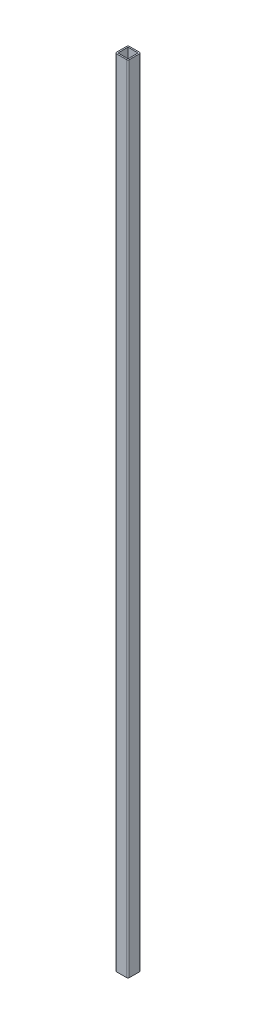
ISO-10303-21;
HEADER;
FILE_DESCRIPTION(('STEP AP214'),'2;1');
FILE_NAME('part.step','',(''),(''),'','','');
FILE_SCHEMA(('AUTOMOTIVE_DESIGN { 1 0 10303 214 1 1 1 1 }'));
ENDSEC;
DATA;
#1=APPLICATION_CONTEXT('core data for automotive mechanical design processes');
#2=APPLICATION_PROTOCOL_DEFINITION('international standard','automotive_design',2000,#1);
#3=PRODUCT_CONTEXT('',#1,'mechanical');
#4=PRODUCT('Part','Part','',(#3));
#5=PRODUCT_RELATED_PRODUCT_CATEGORY('part','',(#4));
#6=PRODUCT_DEFINITION_FORMATION('','',#4);
#7=PRODUCT_DEFINITION_CONTEXT('part definition',#1,'design');
#8=PRODUCT_DEFINITION('design','',#6,#7);
#9=PRODUCT_DEFINITION_SHAPE('','',#8);
#10=(LENGTH_UNIT() NAMED_UNIT(*) SI_UNIT(.MILLI.,.METRE.));
#11=(NAMED_UNIT(*) PLANE_ANGLE_UNIT() SI_UNIT($,.RADIAN.));
#12=(NAMED_UNIT(*) SI_UNIT($,.STERADIAN.) SOLID_ANGLE_UNIT());
#13=UNCERTAINTY_MEASURE_WITH_UNIT(LENGTH_MEASURE(1.E-05),#10,'distance_accuracy_value','');
#14=(GEOMETRIC_REPRESENTATION_CONTEXT(3) GLOBAL_UNCERTAINTY_ASSIGNED_CONTEXT((#13)) GLOBAL_UNIT_ASSIGNED_CONTEXT((#10,
#11,#12)) REPRESENTATION_CONTEXT('',''));
#15=CARTESIAN_POINT('',(0.,0.,0.));
#16=DIRECTION('',(0.,0.,1.));
#17=DIRECTION('',(1.,0.,0.));
#18=AXIS2_PLACEMENT_3D('',#15,#16,#17);
#19=CARTESIAN_POINT('',(22.8,1580.,2.8));
#20=DIRECTION('',(0.,-1.,0.));
#21=DIRECTION('',(0.,0.,-1.));
#22=AXIS2_PLACEMENT_3D('',#19,#20,#21);
#23=CYLINDRICAL_SURFACE('',#22,2.8);
#24=CARTESIAN_POINT('',(22.8,0.,2.8));
#25=DIRECTION('',(0.,1.,0.));
#26=DIRECTION('',(0.,0.,-1.));
#27=AXIS2_PLACEMENT_3D('',#24,#25,#26);
#28=CIRCLE('',#27,2.8);
#29=CARTESIAN_POINT('',(25.6,0.,2.80000000000002));
#30=VERTEX_POINT('',#29);
#31=CARTESIAN_POINT('',(22.8,0.,0.));
#32=VERTEX_POINT('',#31);
#33=EDGE_CURVE('E159',#30,#32,#28,.T.);
#34=ORIENTED_EDGE('',*,*,#33,.T.);
#35=DIRECTION('',(0.,-1.,0.));
#36=VECTOR('',#35,1.);
#37=CARTESIAN_POINT('',(22.8,1580.,0.));
#38=LINE('',#37,#36);
#39=CARTESIAN_POINT('',(22.8,1580.,0.));
#40=VERTEX_POINT('',#39);
#41=EDGE_CURVE('E11',#40,#32,#38,.T.);
#42=ORIENTED_EDGE('',*,*,#41,.F.);
#43=CARTESIAN_POINT('',(22.8,1580.,2.8));
#44=DIRECTION('',(0.,1.,0.));
#45=DIRECTION('',(0.,0.,-1.));
#46=AXIS2_PLACEMENT_3D('',#43,#44,#45);
#47=CIRCLE('',#46,2.8);
#48=CARTESIAN_POINT('',(25.6,1580.,2.80000000000002));
#49=VERTEX_POINT('',#48);
#50=EDGE_CURVE('E160',#49,#40,#47,.T.);
#51=ORIENTED_EDGE('',*,*,#50,.F.);
#52=DIRECTION('',(0.,-1.,0.));
#53=VECTOR('',#52,1.);
#54=CARTESIAN_POINT('',(25.6,1580.,2.80000000000002));
#55=LINE('',#54,#53);
#56=EDGE_CURVE('E178',#49,#30,#55,.T.);
#57=ORIENTED_EDGE('',*,*,#56,.T.);
#58=EDGE_LOOP('',(#34,#42,#51,#57));
#59=FACE_BOUND('',#58,.T.);
#60=ADVANCED_FACE('F34',(#59),#23,.T.);
#61=CARTESIAN_POINT('',(2.80000000000002,1580.,0.));
#62=DIRECTION('',(0.,0.,1.));
#63=DIRECTION('',(1.,0.,0.));
#64=AXIS2_PLACEMENT_3D('',#61,#62,#63);
#65=PLANE('',#64);
#66=DIRECTION('',(-1.,0.,0.));
#67=VECTOR('',#66,1.);
#68=CARTESIAN_POINT('',(2.80000000000002,0.,0.));
#69=LINE('',#68,#67);
#70=CARTESIAN_POINT('',(2.80000000000002,0.,0.));
#71=VERTEX_POINT('',#70);
#72=EDGE_CURVE('E181',#32,#71,#69,.T.);
#73=ORIENTED_EDGE('',*,*,#72,.T.);
#74=DIRECTION('',(0.,-1.,0.));
#75=VECTOR('',#74,1.);
#76=CARTESIAN_POINT('',(2.80000000000002,1580.,0.));
#77=LINE('',#76,#75);
#78=CARTESIAN_POINT('',(2.80000000000002,1580.,0.));
#79=VERTEX_POINT('',#78);
#80=EDGE_CURVE('E41',#79,#71,#77,.T.);
#81=ORIENTED_EDGE('',*,*,#80,.F.);
#82=DIRECTION('',(-1.,0.,0.));
#83=VECTOR('',#82,1.);
#84=CARTESIAN_POINT('',(2.80000000000002,1580.,0.));
#85=LINE('',#84,#83);
#86=EDGE_CURVE('E163',#40,#79,#85,.T.);
#87=ORIENTED_EDGE('',*,*,#86,.F.);
#88=ORIENTED_EDGE('',*,*,#41,.T.);
#89=EDGE_LOOP('',(#73,#81,#87,#88));
#90=FACE_BOUND('',#89,.T.);
#91=ADVANCED_FACE('F236',(#90),#65,.F.);
#92=CARTESIAN_POINT('',(2.8,1580.,2.8));
#93=DIRECTION('',(0.,-1.,0.));
#94=DIRECTION('',(0.,0.,-1.));
#95=AXIS2_PLACEMENT_3D('',#92,#93,#94);
#96=CYLINDRICAL_SURFACE('',#95,2.8);
#97=CARTESIAN_POINT('',(2.8,0.,2.8));
#98=DIRECTION('',(0.,1.,0.));
#99=DIRECTION('',(0.,0.,1.));
#100=AXIS2_PLACEMENT_3D('',#97,#98,#99);
#101=CIRCLE('',#100,2.8);
#102=CARTESIAN_POINT('',(0.,0.,2.80000000000002));
#103=VERTEX_POINT('',#102);
#104=EDGE_CURVE('E183',#71,#103,#101,.T.);
#105=ORIENTED_EDGE('',*,*,#104,.T.);
#106=DIRECTION('',(0.,-1.,0.));
#107=VECTOR('',#106,1.);
#108=CARTESIAN_POINT('',(0.,1580.,2.80000000000002));
#109=LINE('',#108,#107);
#110=CARTESIAN_POINT('',(0.,1580.,2.80000000000002));
#111=VERTEX_POINT('',#110);
#112=EDGE_CURVE('E208',#111,#103,#109,.T.);
#113=ORIENTED_EDGE('',*,*,#112,.F.);
#114=CARTESIAN_POINT('',(2.8,1580.,2.8));
#115=DIRECTION('',(0.,1.,0.));
#116=DIRECTION('',(0.,0.,1.));
#117=AXIS2_PLACEMENT_3D('',#114,#115,#116);
#118=CIRCLE('',#117,2.8);
#119=EDGE_CURVE('E166',#79,#111,#118,.T.);
#120=ORIENTED_EDGE('',*,*,#119,.F.);
#121=ORIENTED_EDGE('',*,*,#80,.T.);
#122=EDGE_LOOP('',(#105,#113,#120,#121));
#123=FACE_BOUND('',#122,.T.);
#124=ADVANCED_FACE('F215',(#123),#96,.T.);
#125=CARTESIAN_POINT('',(0.,1580.,2.80000000000002));
#126=DIRECTION('',(1.,0.,0.));
#127=DIRECTION('',(0.,0.,-1.));
#128=AXIS2_PLACEMENT_3D('',#125,#126,#127);
#129=PLANE('',#128);
#130=DIRECTION('',(0.,0.,1.));
#131=VECTOR('',#130,1.);
#132=CARTESIAN_POINT('',(0.,0.,2.80000000000002));
#133=LINE('',#132,#131);
#134=CARTESIAN_POINT('',(0.,0.,22.8));
#135=VERTEX_POINT('',#134);
#136=EDGE_CURVE('E185',#103,#135,#133,.T.);
#137=ORIENTED_EDGE('',*,*,#136,.T.);
#138=DIRECTION('',(0.,-1.,0.));
#139=VECTOR('',#138,1.);
#140=CARTESIAN_POINT('',(0.,1580.,22.8));
#141=LINE('',#140,#139);
#142=CARTESIAN_POINT('',(0.,1580.,22.8));
#143=VERTEX_POINT('',#142);
#144=EDGE_CURVE('E205',#143,#135,#141,.T.);
#145=ORIENTED_EDGE('',*,*,#144,.F.);
#146=DIRECTION('',(0.,0.,1.));
#147=VECTOR('',#146,1.);
#148=CARTESIAN_POINT('',(0.,1580.,2.80000000000002));
#149=LINE('',#148,#147);
#150=EDGE_CURVE('E168',#111,#143,#149,.T.);
#151=ORIENTED_EDGE('',*,*,#150,.F.);
#152=ORIENTED_EDGE('',*,*,#112,.T.);
#153=EDGE_LOOP('',(#137,#145,#151,#152));
#154=FACE_BOUND('',#153,.T.);
#155=ADVANCED_FACE('F224',(#154),#129,.F.);
#156=CARTESIAN_POINT('',(2.8,1580.,22.8));
#157=DIRECTION('',(0.,-1.,0.));
#158=DIRECTION('',(0.,0.,-1.));
#159=AXIS2_PLACEMENT_3D('',#156,#157,#158);
#160=CYLINDRICAL_SURFACE('',#159,2.8);
#161=CARTESIAN_POINT('',(2.8,0.,22.8));
#162=DIRECTION('',(0.,1.,0.));
#163=DIRECTION('',(0.,0.,1.));
#164=AXIS2_PLACEMENT_3D('',#161,#162,#163);
#165=CIRCLE('',#164,2.8);
#166=CARTESIAN_POINT('',(2.80000000000002,0.,25.6));
#167=VERTEX_POINT('',#166);
#168=EDGE_CURVE('E187',#135,#167,#165,.T.);
#169=ORIENTED_EDGE('',*,*,#168,.T.);
#170=DIRECTION('',(0.,-1.,0.));
#171=VECTOR('',#170,1.);
#172=CARTESIAN_POINT('',(2.80000000000002,1580.,25.6));
#173=LINE('',#172,#171);
#174=CARTESIAN_POINT('',(2.80000000000002,1580.,25.6));
#175=VERTEX_POINT('',#174);
#176=EDGE_CURVE('E202',#175,#167,#173,.T.);
#177=ORIENTED_EDGE('',*,*,#176,.F.);
#178=CARTESIAN_POINT('',(2.8,1580.,22.8));
#179=DIRECTION('',(0.,1.,0.));
#180=DIRECTION('',(0.,0.,1.));
#181=AXIS2_PLACEMENT_3D('',#178,#179,#180);
#182=CIRCLE('',#181,2.8);
#183=EDGE_CURVE('E170',#143,#175,#182,.T.);
#184=ORIENTED_EDGE('',*,*,#183,.F.);
#185=ORIENTED_EDGE('',*,*,#144,.T.);
#186=EDGE_LOOP('',(#169,#177,#184,#185));
#187=FACE_BOUND('',#186,.T.);
#188=ADVANCED_FACE('F228',(#187),#160,.T.);
#189=CARTESIAN_POINT('',(2.80000000000002,1580.,25.6));
#190=DIRECTION('',(0.,0.,-1.));
#191=DIRECTION('',(-1.,0.,0.));
#192=AXIS2_PLACEMENT_3D('',#189,#190,#191);
#193=PLANE('',#192);
#194=DIRECTION('',(1.,0.,0.));
#195=VECTOR('',#194,1.);
#196=CARTESIAN_POINT('',(2.80000000000002,0.,25.6));
#197=LINE('',#196,#195);
#198=CARTESIAN_POINT('',(22.8,0.,25.6));
#199=VERTEX_POINT('',#198);
#200=EDGE_CURVE('E189',#167,#199,#197,.T.);
#201=ORIENTED_EDGE('',*,*,#200,.T.);
#202=DIRECTION('',(0.,-1.,0.));
#203=VECTOR('',#202,1.);
#204=CARTESIAN_POINT('',(22.8,1580.,25.6));
#205=LINE('',#204,#203);
#206=CARTESIAN_POINT('',(22.8,1580.,25.6));
#207=VERTEX_POINT('',#206);
#208=EDGE_CURVE('E199',#207,#199,#205,.T.);
#209=ORIENTED_EDGE('',*,*,#208,.F.);
#210=DIRECTION('',(1.,0.,0.));
#211=VECTOR('',#210,1.);
#212=CARTESIAN_POINT('',(2.80000000000002,1580.,25.6));
#213=LINE('',#212,#211);
#214=EDGE_CURVE('E172',#175,#207,#213,.T.);
#215=ORIENTED_EDGE('',*,*,#214,.F.);
#216=ORIENTED_EDGE('',*,*,#176,.T.);
#217=EDGE_LOOP('',(#201,#209,#215,#216));
#218=FACE_BOUND('',#217,.T.);
#219=ADVANCED_FACE('F249',(#218),#193,.F.);
#220=CARTESIAN_POINT('',(22.8,1580.,22.8));
#221=DIRECTION('',(0.,-1.,0.));
#222=DIRECTION('',(0.,0.,-1.));
#223=AXIS2_PLACEMENT_3D('',#220,#221,#222);
#224=CYLINDRICAL_SURFACE('',#223,2.8);
#225=CARTESIAN_POINT('',(22.8,0.,22.8));
#226=DIRECTION('',(0.,1.,0.));
#227=DIRECTION('',(0.,0.,1.));
#228=AXIS2_PLACEMENT_3D('',#225,#226,#227);
#229=CIRCLE('',#228,2.8);
#230=CARTESIAN_POINT('',(25.6,0.,22.8));
#231=VERTEX_POINT('',#230);
#232=EDGE_CURVE('E191',#199,#231,#229,.T.);
#233=ORIENTED_EDGE('',*,*,#232,.T.);
#234=DIRECTION('',(0.,-1.,0.));
#235=VECTOR('',#234,1.);
#236=CARTESIAN_POINT('',(25.6,1580.,22.8));
#237=LINE('',#236,#235);
#238=CARTESIAN_POINT('',(25.6,1580.,22.8));
#239=VERTEX_POINT('',#238);
#240=EDGE_CURVE('E196',#239,#231,#237,.T.);
#241=ORIENTED_EDGE('',*,*,#240,.F.);
#242=CARTESIAN_POINT('',(22.8,1580.,22.8));
#243=DIRECTION('',(0.,1.,0.));
#244=DIRECTION('',(0.,0.,1.));
#245=AXIS2_PLACEMENT_3D('',#242,#243,#244);
#246=CIRCLE('',#245,2.8);
#247=EDGE_CURVE('E174',#207,#239,#246,.T.);
#248=ORIENTED_EDGE('',*,*,#247,.F.);
#249=ORIENTED_EDGE('',*,*,#208,.T.);
#250=EDGE_LOOP('',(#233,#241,#248,#249));
#251=FACE_BOUND('',#250,.T.);
#252=ADVANCED_FACE('F247',(#251),#224,.T.);
#253=CARTESIAN_POINT('',(25.6,1580.,2.80000000000002));
#254=DIRECTION('',(-1.,0.,0.));
#255=DIRECTION('',(0.,0.,1.));
#256=AXIS2_PLACEMENT_3D('',#253,#254,#255);
#257=PLANE('',#256);
#258=DIRECTION('',(0.,0.,-1.));
#259=VECTOR('',#258,1.);
#260=CARTESIAN_POINT('',(25.6,0.,2.80000000000002));
#261=LINE('',#260,#259);
#262=EDGE_CURVE('E164',#231,#30,#261,.T.);
#263=ORIENTED_EDGE('',*,*,#262,.T.);
#264=ORIENTED_EDGE('',*,*,#56,.F.);
#265=DIRECTION('',(0.,0.,-1.));
#266=VECTOR('',#265,1.);
#267=CARTESIAN_POINT('',(25.6,1580.,2.80000000000002));
#268=LINE('',#267,#266);
#269=EDGE_CURVE('E176',#239,#49,#268,.T.);
#270=ORIENTED_EDGE('',*,*,#269,.F.);
#271=ORIENTED_EDGE('',*,*,#240,.T.);
#272=EDGE_LOOP('',(#263,#264,#270,#271));
#273=FACE_BOUND('',#272,.T.);
#274=ADVANCED_FACE('F242',(#273),#257,.F.);
#275=CARTESIAN_POINT('',(22.8,1580.,2.8));
#276=DIRECTION('',(0.,-1.,0.));
#277=DIRECTION('',(0.,0.,-1.));
#278=AXIS2_PLACEMENT_3D('',#275,#276,#277);
#279=PLANE('',#278);
#280=DIRECTION('',(1.,0.,0.));
#281=VECTOR('',#280,1.);
#282=CARTESIAN_POINT('',(22.8,1580.,2.8));
#283=LINE('',#282,#281);
#284=CARTESIAN_POINT('',(2.8,1580.,2.8));
#285=VERTEX_POINT('',#284);
#286=CARTESIAN_POINT('',(22.8,1580.,2.8));
#287=VERTEX_POINT('',#286);
#288=EDGE_CURVE('E153',#285,#287,#283,.T.);
#289=ORIENTED_EDGE('',*,*,#288,.T.);
#290=DIRECTION('',(0.,0.,1.));
#291=VECTOR('',#290,1.);
#292=CARTESIAN_POINT('',(22.8,1580.,2.8));
#293=LINE('',#292,#291);
#294=CARTESIAN_POINT('',(22.8,1580.,22.8));
#295=VERTEX_POINT('',#294);
#296=EDGE_CURVE('E156',#287,#295,#293,.T.);
#297=ORIENTED_EDGE('',*,*,#296,.T.);
#298=DIRECTION('',(-1.,0.,0.));
#299=VECTOR('',#298,1.);
#300=CARTESIAN_POINT('',(22.8,1580.,22.8));
#301=LINE('',#300,#299);
#302=CARTESIAN_POINT('',(2.8,1580.,22.8));
#303=VERTEX_POINT('',#302);
#304=EDGE_CURVE('E148',#295,#303,#301,.T.);
#305=ORIENTED_EDGE('',*,*,#304,.T.);
#306=DIRECTION('',(0.,0.,-1.));
#307=VECTOR('',#306,1.);
#308=CARTESIAN_POINT('',(2.8,1580.,2.79999999999999));
#309=LINE('',#308,#307);
#310=EDGE_CURVE('E128',#303,#285,#309,.T.);
#311=ORIENTED_EDGE('',*,*,#310,.T.);
#312=EDGE_LOOP('',(#289,#297,#305,#311));
#313=FACE_BOUND('',#312,.T.);
#314=ORIENTED_EDGE('',*,*,#50,.T.);
#315=ORIENTED_EDGE('',*,*,#86,.T.);
#316=ORIENTED_EDGE('',*,*,#119,.T.);
#317=ORIENTED_EDGE('',*,*,#150,.T.);
#318=ORIENTED_EDGE('',*,*,#183,.T.);
#319=ORIENTED_EDGE('',*,*,#214,.T.);
#320=ORIENTED_EDGE('',*,*,#247,.T.);
#321=ORIENTED_EDGE('',*,*,#269,.T.);
#322=EDGE_LOOP('',(#314,#315,#316,#317,#318,#319,#320,#321));
#323=FACE_BOUND('',#322,.T.);
#324=ADVANCED_FACE('F232',(#313,#323),#279,.F.);
#325=CARTESIAN_POINT('',(22.8,0.,2.8));
#326=DIRECTION('',(0.,-1.,0.));
#327=DIRECTION('',(0.,0.,-1.));
#328=AXIS2_PLACEMENT_3D('',#325,#326,#327);
#329=PLANE('',#328);
#330=DIRECTION('',(0.,0.,1.));
#331=VECTOR('',#330,1.);
#332=CARTESIAN_POINT('',(22.8,0.,2.8));
#333=LINE('',#332,#331);
#334=CARTESIAN_POINT('',(22.8,0.,2.8));
#335=VERTEX_POINT('',#334);
#336=CARTESIAN_POINT('',(22.8,0.,22.8));
#337=VERTEX_POINT('',#336);
#338=EDGE_CURVE('E56',#335,#337,#333,.T.);
#339=ORIENTED_EDGE('',*,*,#338,.F.);
#340=DIRECTION('',(1.,0.,0.));
#341=VECTOR('',#340,1.);
#342=CARTESIAN_POINT('',(2.8,0.,2.8));
#343=LINE('',#342,#341);
#344=CARTESIAN_POINT('',(2.8,0.,2.8));
#345=VERTEX_POINT('',#344);
#346=EDGE_CURVE('E141',#345,#335,#343,.T.);
#347=ORIENTED_EDGE('',*,*,#346,.F.);
#348=DIRECTION('',(0.,0.,-1.));
#349=VECTOR('',#348,1.);
#350=CARTESIAN_POINT('',(2.8,0.,2.8));
#351=LINE('',#350,#349);
#352=CARTESIAN_POINT('',(2.8,0.,22.8));
#353=VERTEX_POINT('',#352);
#354=EDGE_CURVE('E125',#353,#345,#351,.T.);
#355=ORIENTED_EDGE('',*,*,#354,.F.);
#356=DIRECTION('',(-1.,0.,0.));
#357=VECTOR('',#356,1.);
#358=CARTESIAN_POINT('',(2.8,0.,22.8));
#359=LINE('',#358,#357);
#360=EDGE_CURVE('E134',#337,#353,#359,.T.);
#361=ORIENTED_EDGE('',*,*,#360,.F.);
#362=EDGE_LOOP('',(#339,#347,#355,#361));
#363=FACE_BOUND('',#362,.T.);
#364=ORIENTED_EDGE('',*,*,#33,.F.);
#365=ORIENTED_EDGE('',*,*,#262,.F.);
#366=ORIENTED_EDGE('',*,*,#232,.F.);
#367=ORIENTED_EDGE('',*,*,#200,.F.);
#368=ORIENTED_EDGE('',*,*,#168,.F.);
#369=ORIENTED_EDGE('',*,*,#136,.F.);
#370=ORIENTED_EDGE('',*,*,#104,.F.);
#371=ORIENTED_EDGE('',*,*,#72,.F.);
#372=EDGE_LOOP('',(#364,#365,#366,#367,#368,#369,#370,#371));
#373=FACE_BOUND('',#372,.T.);
#374=ADVANCED_FACE('F138',(#363,#373),#329,.T.);
#375=CARTESIAN_POINT('',(22.8,1770.,2.8));
#376=DIRECTION('',(1.,0.,0.));
#377=DIRECTION('',(0.,0.,-1.));
#378=AXIS2_PLACEMENT_3D('',#375,#376,#377);
#379=PLANE('',#378);
#380=DIRECTION('',(0.,-1.,0.));
#381=VECTOR('',#380,1.);
#382=CARTESIAN_POINT('',(22.8,1770.,2.8));
#383=LINE('',#382,#381);
#384=EDGE_CURVE('E146',#287,#335,#383,.T.);
#385=ORIENTED_EDGE('',*,*,#384,.T.);
#386=ORIENTED_EDGE('',*,*,#338,.T.);
#387=DIRECTION('',(0.,-1.,0.));
#388=VECTOR('',#387,1.);
#389=CARTESIAN_POINT('',(22.8,1770.,22.8));
#390=LINE('',#389,#388);
#391=EDGE_CURVE('E131',#295,#337,#390,.T.);
#392=ORIENTED_EDGE('',*,*,#391,.F.);
#393=ORIENTED_EDGE('',*,*,#296,.F.);
#394=EDGE_LOOP('',(#385,#386,#392,#393));
#395=FACE_BOUND('',#394,.T.);
#396=ADVANCED_FACE('F312',(#395),#379,.F.);
#397=CARTESIAN_POINT('',(2.8,1770.,2.8));
#398=DIRECTION('',(0.,0.,-1.));
#399=DIRECTION('',(-1.,0.,0.));
#400=AXIS2_PLACEMENT_3D('',#397,#398,#399);
#401=PLANE('',#400);
#402=DIRECTION('',(0.,-1.,0.));
#403=VECTOR('',#402,1.);
#404=CARTESIAN_POINT('',(2.8,1770.,2.8));
#405=LINE('',#404,#403);
#406=EDGE_CURVE('E130',#285,#345,#405,.T.);
#407=ORIENTED_EDGE('',*,*,#406,.T.);
#408=ORIENTED_EDGE('',*,*,#346,.T.);
#409=ORIENTED_EDGE('',*,*,#384,.F.);
#410=ORIENTED_EDGE('',*,*,#288,.F.);
#411=EDGE_LOOP('',(#407,#408,#409,#410));
#412=FACE_BOUND('',#411,.T.);
#413=ADVANCED_FACE('F321',(#412),#401,.F.);
#414=CARTESIAN_POINT('',(2.8,1770.,2.8));
#415=DIRECTION('',(-1.,0.,0.));
#416=DIRECTION('',(0.,0.,1.));
#417=AXIS2_PLACEMENT_3D('',#414,#415,#416);
#418=PLANE('',#417);
#419=DIRECTION('',(0.,-1.,0.));
#420=VECTOR('',#419,1.);
#421=CARTESIAN_POINT('',(2.8,1770.,22.8));
#422=LINE('',#421,#420);
#423=EDGE_CURVE('E48',#303,#353,#422,.T.);
#424=ORIENTED_EDGE('',*,*,#423,.T.);
#425=ORIENTED_EDGE('',*,*,#354,.T.);
#426=ORIENTED_EDGE('',*,*,#406,.F.);
#427=ORIENTED_EDGE('',*,*,#310,.F.);
#428=EDGE_LOOP('',(#424,#425,#426,#427));
#429=FACE_BOUND('',#428,.T.);
#430=ADVANCED_FACE('F122',(#429),#418,.F.);
#431=CARTESIAN_POINT('',(2.8,1770.,22.8));
#432=DIRECTION('',(0.,0.,1.));
#433=DIRECTION('',(1.,0.,0.));
#434=AXIS2_PLACEMENT_3D('',#431,#432,#433);
#435=PLANE('',#434);
#436=ORIENTED_EDGE('',*,*,#391,.T.);
#437=ORIENTED_EDGE('',*,*,#360,.T.);
#438=ORIENTED_EDGE('',*,*,#423,.F.);
#439=ORIENTED_EDGE('',*,*,#304,.F.);
#440=EDGE_LOOP('',(#436,#437,#438,#439));
#441=FACE_BOUND('',#440,.T.);
#442=ADVANCED_FACE('F135',(#441),#435,.F.);
#443=CLOSED_SHELL('',(#60,#91,#124,#155,#188,#219,#252,#274,#324,#374,#396,#413,#430,#442));
#444=MANIFOLD_SOLID_BREP('B2',#443);
#445=ADVANCED_BREP_SHAPE_REPRESENTATION('',(#18,#444),#14);
#446=SHAPE_DEFINITION_REPRESENTATION(#9,#445);
ENDSEC;
END-ISO-10303-21;
